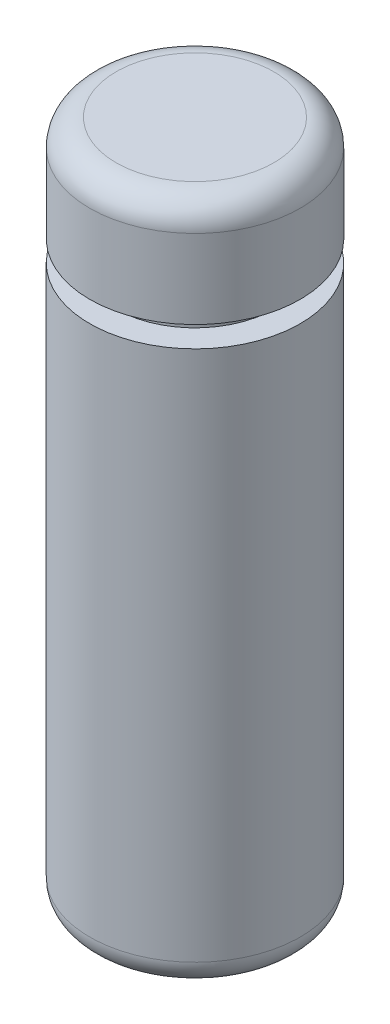
ISO-10303-21;
HEADER;
FILE_DESCRIPTION(('STEP AP214'),'2;1');
FILE_NAME('part.step','',(''),(''),'','','');
FILE_SCHEMA(('AUTOMOTIVE_DESIGN { 1 0 10303 214 1 1 1 1 }'));
ENDSEC;
DATA;
#1=APPLICATION_CONTEXT('core data for automotive mechanical design processes');
#2=APPLICATION_PROTOCOL_DEFINITION('international standard','automotive_design',2000,#1);
#3=PRODUCT_CONTEXT('',#1,'mechanical');
#4=PRODUCT('Part','Part','',(#3));
#5=PRODUCT_RELATED_PRODUCT_CATEGORY('part','',(#4));
#6=PRODUCT_DEFINITION_FORMATION('','',#4);
#7=PRODUCT_DEFINITION_CONTEXT('part definition',#1,'design');
#8=PRODUCT_DEFINITION('design','',#6,#7);
#9=PRODUCT_DEFINITION_SHAPE('','',#8);
#10=(LENGTH_UNIT() NAMED_UNIT(*) SI_UNIT(.MILLI.,.METRE.));
#11=(NAMED_UNIT(*) PLANE_ANGLE_UNIT() SI_UNIT($,.RADIAN.));
#12=(NAMED_UNIT(*) SI_UNIT($,.STERADIAN.) SOLID_ANGLE_UNIT());
#13=UNCERTAINTY_MEASURE_WITH_UNIT(LENGTH_MEASURE(1.E-05),#10,'distance_accuracy_value','');
#14=(GEOMETRIC_REPRESENTATION_CONTEXT(3) GLOBAL_UNCERTAINTY_ASSIGNED_CONTEXT((#13)) GLOBAL_UNIT_ASSIGNED_CONTEXT((#10,
#11,#12)) REPRESENTATION_CONTEXT('',''));
#15=CARTESIAN_POINT('',(0.,0.,0.));
#16=DIRECTION('',(0.,0.,1.));
#17=DIRECTION('',(1.,0.,0.));
#18=AXIS2_PLACEMENT_3D('',#15,#16,#17);
#19=CARTESIAN_POINT('',(0.,0.,0.));
#20=DIRECTION('',(0.,-1.,0.));
#21=DIRECTION('',(0.,0.,-1.));
#22=AXIS2_PLACEMENT_3D('',#19,#20,#21);
#23=CYLINDRICAL_SURFACE('',#22,4.);
#24=CARTESIAN_POINT('',(0.,21.2,0.));
#25=DIRECTION('',(0.,-1.,0.));
#26=DIRECTION('',(0.,0.,-1.));
#27=AXIS2_PLACEMENT_3D('',#24,#25,#26);
#28=CIRCLE('',#27,4.);
#29=CARTESIAN_POINT('',(0.,21.2,-4.));
#30=VERTEX_POINT('',#29);
#31=EDGE_CURVE('E34',#30,#30,#28,.F.);
#32=ORIENTED_EDGE('',*,*,#31,.F.);
#33=EDGE_LOOP('',(#32));
#34=FACE_BOUND('',#33,.T.);
#35=CARTESIAN_POINT('',(0.,1.,0.));
#36=DIRECTION('',(0.,-1.,0.));
#37=DIRECTION('',(0.,0.,-1.));
#38=AXIS2_PLACEMENT_3D('',#35,#36,#37);
#39=CIRCLE('',#38,4.);
#40=CARTESIAN_POINT('',(0.,1.,-4.));
#41=VERTEX_POINT('',#40);
#42=EDGE_CURVE('E52',#41,#41,#39,.F.);
#43=ORIENTED_EDGE('',*,*,#42,.T.);
#44=EDGE_LOOP('',(#43));
#45=FACE_BOUND('',#44,.T.);
#46=ADVANCED_FACE('F30',(#34,#45),#23,.T.);
#47=CARTESIAN_POINT('',(4.,0.,0.));
#48=DIRECTION('',(0.,-1.,0.));
#49=DIRECTION('',(0.,0.,-1.));
#50=AXIS2_PLACEMENT_3D('',#47,#48,#49);
#51=PLANE('',#50);
#52=CARTESIAN_POINT('',(0.,0.,0.));
#53=DIRECTION('',(0.,-1.,0.));
#54=DIRECTION('',(0.,0.,-1.));
#55=AXIS2_PLACEMENT_3D('',#52,#53,#54);
#56=CIRCLE('',#55,3.);
#57=CARTESIAN_POINT('',(0.,0.,-3.));
#58=VERTEX_POINT('',#57);
#59=EDGE_CURVE('E10',#58,#58,#56,.T.);
#60=ORIENTED_EDGE('',*,*,#59,.T.);
#61=EDGE_LOOP('',(#60));
#62=FACE_BOUND('',#61,.T.);
#63=ADVANCED_FACE('F82',(#62),#51,.T.);
#64=CARTESIAN_POINT('',(0.,1.,0.));
#65=DIRECTION('',(0.,-1.,0.));
#66=DIRECTION('',(0.,0.,-1.));
#67=AXIS2_PLACEMENT_3D('',#64,#65,#66);
#68=TOROIDAL_SURFACE('',#67,3.,1.);
#69=ORIENTED_EDGE('',*,*,#42,.F.);
#70=EDGE_LOOP('',(#69));
#71=FACE_BOUND('',#70,.T.);
#72=ORIENTED_EDGE('',*,*,#59,.F.);
#73=EDGE_LOOP('',(#72));
#74=FACE_BOUND('',#73,.T.);
#75=ADVANCED_FACE('F32',(#71,#74),#68,.T.);
#76=CARTESIAN_POINT('',(0.,25.,0.));
#77=DIRECTION('',(0.,1.,0.));
#78=DIRECTION('',(0.,0.,1.));
#79=AXIS2_PLACEMENT_3D('',#76,#77,#78);
#80=CYLINDRICAL_SURFACE('',#79,3.02317374222936);
#81=CARTESIAN_POINT('',(0.,22.,0.));
#82=DIRECTION('',(0.,1.,0.));
#83=DIRECTION('',(0.,0.,1.));
#84=AXIS2_PLACEMENT_3D('',#81,#82,#83);
#85=CIRCLE('',#84,3.02317374222936);
#86=CARTESIAN_POINT('',(0.,22.,3.02317374222936));
#87=VERTEX_POINT('',#86);
#88=EDGE_CURVE('E54',#87,#87,#85,.T.);
#89=ORIENTED_EDGE('',*,*,#88,.F.);
#90=EDGE_LOOP('',(#89));
#91=FACE_BOUND('',#90,.T.);
#92=CARTESIAN_POINT('',(0.,21.2,0.));
#93=DIRECTION('',(0.,1.,0.));
#94=DIRECTION('',(0.,0.,1.));
#95=AXIS2_PLACEMENT_3D('',#92,#93,#94);
#96=CIRCLE('',#95,3.02317374222936);
#97=CARTESIAN_POINT('',(0.,21.2,3.02317374222936));
#98=VERTEX_POINT('',#97);
#99=EDGE_CURVE('E48',#98,#98,#96,.T.);
#100=ORIENTED_EDGE('',*,*,#99,.T.);
#101=EDGE_LOOP('',(#100));
#102=FACE_BOUND('',#101,.T.);
#103=ADVANCED_FACE('F91',(#91,#102),#80,.T.);
#104=CARTESIAN_POINT('',(-3.02317374222936,21.2,0.));
#105=DIRECTION('',(0.,-1.,0.));
#106=DIRECTION('',(0.,0.,-1.));
#107=AXIS2_PLACEMENT_3D('',#104,#105,#106);
#108=PLANE('',#107);
#109=ORIENTED_EDGE('',*,*,#31,.T.);
#110=EDGE_LOOP('',(#109));
#111=FACE_BOUND('',#110,.T.);
#112=ORIENTED_EDGE('',*,*,#99,.F.);
#113=EDGE_LOOP('',(#112));
#114=FACE_BOUND('',#113,.T.);
#115=ADVANCED_FACE('F94',(#111,#114),#108,.F.);
#116=CARTESIAN_POINT('',(-3.02317374222936,22.,0.));
#117=DIRECTION('',(0.,1.,0.));
#118=DIRECTION('',(0.,0.,1.));
#119=AXIS2_PLACEMENT_3D('',#116,#117,#118);
#120=PLANE('',#119);
#121=CARTESIAN_POINT('',(0.,22.,0.));
#122=DIRECTION('',(0.,1.,0.));
#123=DIRECTION('',(0.,0.,1.));
#124=AXIS2_PLACEMENT_3D('',#121,#122,#123);
#125=CIRCLE('',#124,4.);
#126=CARTESIAN_POINT('',(0.,22.,4.));
#127=VERTEX_POINT('',#126);
#128=EDGE_CURVE('E46',#127,#127,#125,.F.);
#129=ORIENTED_EDGE('',*,*,#128,.T.);
#130=EDGE_LOOP('',(#129));
#131=FACE_BOUND('',#130,.T.);
#132=ORIENTED_EDGE('',*,*,#88,.T.);
#133=EDGE_LOOP('',(#132));
#134=FACE_BOUND('',#133,.T.);
#135=ADVANCED_FACE('F77',(#131,#134),#120,.F.);
#136=CARTESIAN_POINT('',(0.,26.,0.));
#137=DIRECTION('',(0.,1.,0.));
#138=DIRECTION('',(0.,0.,1.));
#139=AXIS2_PLACEMENT_3D('',#136,#137,#138);
#140=PLANE('',#139);
#141=CARTESIAN_POINT('',(0.,26.,0.));
#142=DIRECTION('',(0.,1.,0.));
#143=DIRECTION('',(0.,0.,1.));
#144=AXIS2_PLACEMENT_3D('',#141,#142,#143);
#145=CIRCLE('',#144,3.);
#146=CARTESIAN_POINT('',(0.,26.,3.));
#147=VERTEX_POINT('',#146);
#148=EDGE_CURVE('E38',#147,#147,#145,.T.);
#149=ORIENTED_EDGE('',*,*,#148,.T.);
#150=EDGE_LOOP('',(#149));
#151=FACE_BOUND('',#150,.T.);
#152=ADVANCED_FACE('F69',(#151),#140,.T.);
#153=CARTESIAN_POINT('',(0.,25.,0.));
#154=DIRECTION('',(0.,1.,0.));
#155=DIRECTION('',(0.,0.,1.));
#156=AXIS2_PLACEMENT_3D('',#153,#154,#155);
#157=TOROIDAL_SURFACE('',#156,3.,1.);
#158=ORIENTED_EDGE('',*,*,#148,.F.);
#159=EDGE_LOOP('',(#158));
#160=FACE_BOUND('',#159,.T.);
#161=CARTESIAN_POINT('',(0.,25.,0.));
#162=DIRECTION('',(0.,1.,0.));
#163=DIRECTION('',(0.,0.,1.));
#164=AXIS2_PLACEMENT_3D('',#161,#162,#163);
#165=CIRCLE('',#164,4.);
#166=CARTESIAN_POINT('',(0.,25.,4.));
#167=VERTEX_POINT('',#166);
#168=EDGE_CURVE('E43',#167,#167,#165,.F.);
#169=ORIENTED_EDGE('',*,*,#168,.F.);
#170=EDGE_LOOP('',(#169));
#171=FACE_BOUND('',#170,.T.);
#172=ADVANCED_FACE('F67',(#160,#171),#157,.T.);
#173=ORIENTED_EDGE('',*,*,#128,.F.);
#174=EDGE_LOOP('',(#173));
#175=FACE_BOUND('',#174,.T.);
#176=ORIENTED_EDGE('',*,*,#168,.T.);
#177=EDGE_LOOP('',(#176));
#178=FACE_BOUND('',#177,.T.);
#179=ADVANCED_FACE('F65',(#175,#178),#23,.T.);
#180=CLOSED_SHELL('',(#46,#63,#75,#103,#115,#135,#152,#172,#179));
#181=MANIFOLD_SOLID_BREP('B2',#180);
#182=ADVANCED_BREP_SHAPE_REPRESENTATION('',(#18,#181),#14);
#183=SHAPE_DEFINITION_REPRESENTATION(#9,#182);
ENDSEC;
END-ISO-10303-21;
